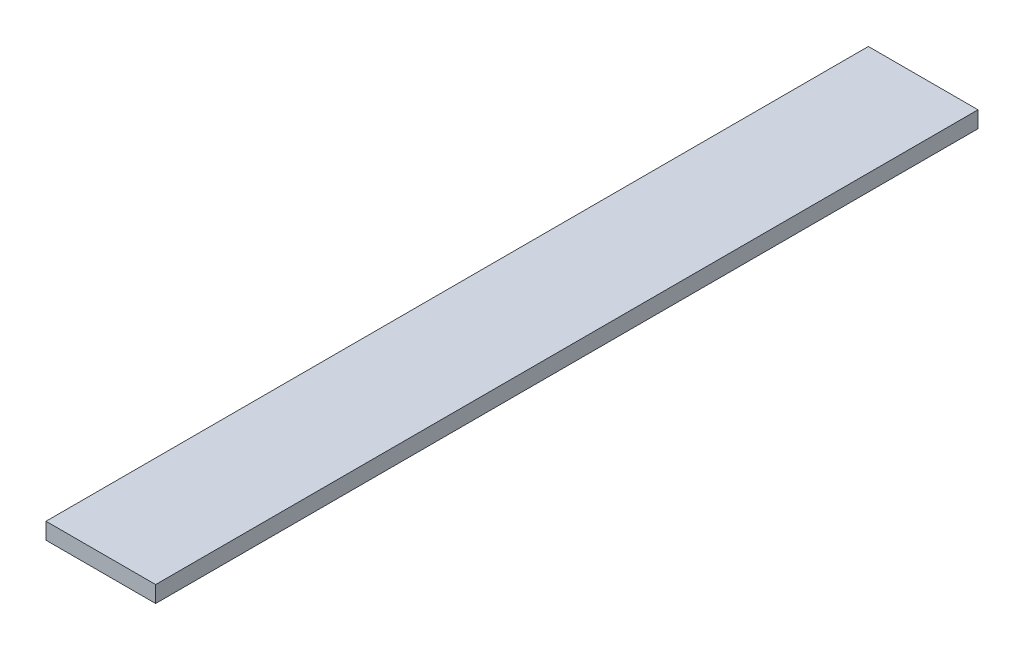
ISO-10303-21;
HEADER;
FILE_DESCRIPTION(('STEP AP214'),'2;1');
FILE_NAME('part.step','',(''),(''),'','','');
FILE_SCHEMA(('AUTOMOTIVE_DESIGN { 1 0 10303 214 1 1 1 1 }'));
ENDSEC;
DATA;
#1=APPLICATION_CONTEXT('core data for automotive mechanical design processes');
#2=APPLICATION_PROTOCOL_DEFINITION('international standard','automotive_design',2000,#1);
#3=PRODUCT_CONTEXT('',#1,'mechanical');
#4=PRODUCT('Part','Part','',(#3));
#5=PRODUCT_RELATED_PRODUCT_CATEGORY('part','',(#4));
#6=PRODUCT_DEFINITION_FORMATION('','',#4);
#7=PRODUCT_DEFINITION_CONTEXT('part definition',#1,'design');
#8=PRODUCT_DEFINITION('design','',#6,#7);
#9=PRODUCT_DEFINITION_SHAPE('','',#8);
#10=(LENGTH_UNIT() NAMED_UNIT(*) SI_UNIT(.MILLI.,.METRE.));
#11=(NAMED_UNIT(*) PLANE_ANGLE_UNIT() SI_UNIT($,.RADIAN.));
#12=(NAMED_UNIT(*) SI_UNIT($,.STERADIAN.) SOLID_ANGLE_UNIT());
#13=UNCERTAINTY_MEASURE_WITH_UNIT(LENGTH_MEASURE(1.E-05),#10,'distance_accuracy_value','');
#14=(GEOMETRIC_REPRESENTATION_CONTEXT(3) GLOBAL_UNCERTAINTY_ASSIGNED_CONTEXT((#13)) GLOBAL_UNIT_ASSIGNED_CONTEXT((#10,
#11,#12)) REPRESENTATION_CONTEXT('',''));
#15=CARTESIAN_POINT('',(0.,0.,0.));
#16=DIRECTION('',(0.,0.,1.));
#17=DIRECTION('',(1.,0.,0.));
#18=AXIS2_PLACEMENT_3D('',#15,#16,#17);
#19=CARTESIAN_POINT('',(0.259740404881448,8.61131713565076,0.));
#20=DIRECTION('',(0.,-1.,0.));
#21=DIRECTION('',(0.,0.,-1.));
#22=AXIS2_PLACEMENT_3D('',#19,#20,#21);
#23=PLANE('',#22);
#24=DIRECTION('',(1.,0.,0.));
#25=VECTOR('',#24,1.);
#26=CARTESIAN_POINT('',(-4.74025959511857,8.61131713565076,-37.5));
#27=LINE('',#26,#25);
#28=CARTESIAN_POINT('',(-9.74025959511856,8.61131713565076,-37.5));
#29=VERTEX_POINT('',#28);
#30=CARTESIAN_POINT('',(0.259740404881448,8.61131713565076,-37.5));
#31=VERTEX_POINT('',#30);
#32=EDGE_CURVE('E53',#29,#31,#27,.T.);
#33=ORIENTED_EDGE('',*,*,#32,.T.);
#34=DIRECTION('',(0.,0.,-1.));
#35=VECTOR('',#34,1.);
#36=CARTESIAN_POINT('',(0.259740404881448,8.61131713565076,0.));
#37=LINE('',#36,#35);
#38=CARTESIAN_POINT('',(0.259740404881448,8.61131713565076,37.5));
#39=VERTEX_POINT('',#38);
#40=EDGE_CURVE('E72',#39,#31,#37,.T.);
#41=ORIENTED_EDGE('',*,*,#40,.F.);
#42=DIRECTION('',(1.,0.,0.));
#43=VECTOR('',#42,1.);
#44=CARTESIAN_POINT('',(-4.74025959511857,8.61131713565076,37.5));
#45=LINE('',#44,#43);
#46=CARTESIAN_POINT('',(-9.74025959511856,8.61131713565076,37.5));
#47=VERTEX_POINT('',#46);
#48=EDGE_CURVE('E61',#47,#39,#45,.T.);
#49=ORIENTED_EDGE('',*,*,#48,.F.);
#50=DIRECTION('',(0.,0.,1.));
#51=VECTOR('',#50,1.);
#52=CARTESIAN_POINT('',(-9.74025959511856,8.61131713565076,0.));
#53=LINE('',#52,#51);
#54=EDGE_CURVE('E83',#29,#47,#53,.T.);
#55=ORIENTED_EDGE('',*,*,#54,.F.);
#56=EDGE_LOOP('',(#33,#41,#49,#55));
#57=FACE_BOUND('',#56,.T.);
#58=ADVANCED_FACE('F17',(#57),#23,.T.);
#59=CARTESIAN_POINT('',(-4.74025959511857,9.36131713565076,37.5));
#60=DIRECTION('',(0.,0.,1.));
#61=DIRECTION('',(1.,0.,0.));
#62=AXIS2_PLACEMENT_3D('',#59,#60,#61);
#63=PLANE('',#62);
#64=DIRECTION('',(0.,1.,0.));
#65=VECTOR('',#64,1.);
#66=CARTESIAN_POINT('',(0.259740404881448,10.1113171356508,37.5));
#67=LINE('',#66,#65);
#68=CARTESIAN_POINT('',(0.259740404881448,10.1113171356508,37.5));
#69=VERTEX_POINT('',#68);
#70=EDGE_CURVE('E65',#69,#39,#67,.F.);
#71=ORIENTED_EDGE('',*,*,#70,.F.);
#72=DIRECTION('',(1.,0.,0.));
#73=VECTOR('',#72,1.);
#74=CARTESIAN_POINT('',(-9.74025959511856,10.1113171356508,37.5));
#75=LINE('',#74,#73);
#76=CARTESIAN_POINT('',(-9.74025959511856,10.1113171356508,37.5));
#77=VERTEX_POINT('',#76);
#78=EDGE_CURVE('E21',#77,#69,#75,.T.);
#79=ORIENTED_EDGE('',*,*,#78,.F.);
#80=DIRECTION('',(0.,1.,0.));
#81=VECTOR('',#80,1.);
#82=CARTESIAN_POINT('',(-9.74025959511856,8.61131713565076,37.5));
#83=LINE('',#82,#81);
#84=EDGE_CURVE('E67',#47,#77,#83,.T.);
#85=ORIENTED_EDGE('',*,*,#84,.F.);
#86=ORIENTED_EDGE('',*,*,#48,.T.);
#87=EDGE_LOOP('',(#71,#79,#85,#86));
#88=FACE_BOUND('',#87,.T.);
#89=ADVANCED_FACE('F63',(#88),#63,.T.);
#90=CARTESIAN_POINT('',(0.259740404881448,10.1113171356508,0.));
#91=DIRECTION('',(1.,0.,0.));
#92=DIRECTION('',(0.,0.,-1.));
#93=AXIS2_PLACEMENT_3D('',#90,#91,#92);
#94=PLANE('',#93);
#95=DIRECTION('',(0.,1.,0.));
#96=VECTOR('',#95,1.);
#97=CARTESIAN_POINT('',(0.259740404881448,9.36131713565076,-37.5));
#98=LINE('',#97,#96);
#99=CARTESIAN_POINT('',(0.259740404881448,10.1113171356508,-37.5));
#100=VERTEX_POINT('',#99);
#101=EDGE_CURVE('E80',#31,#100,#98,.T.);
#102=ORIENTED_EDGE('',*,*,#101,.T.);
#103=DIRECTION('',(0.,0.,1.));
#104=VECTOR('',#103,1.);
#105=CARTESIAN_POINT('',(0.259740404881447,10.1113171356508,0.));
#106=LINE('',#105,#104);
#107=EDGE_CURVE('E77',#69,#100,#106,.F.);
#108=ORIENTED_EDGE('',*,*,#107,.F.);
#109=ORIENTED_EDGE('',*,*,#70,.T.);
#110=ORIENTED_EDGE('',*,*,#40,.T.);
#111=EDGE_LOOP('',(#102,#108,#109,#110));
#112=FACE_BOUND('',#111,.T.);
#113=ADVANCED_FACE('F75',(#112),#94,.T.);
#114=CARTESIAN_POINT('',(-4.74025959511857,9.36131713565076,-37.5));
#115=DIRECTION('',(0.,0.,1.));
#116=DIRECTION('',(1.,0.,0.));
#117=AXIS2_PLACEMENT_3D('',#114,#115,#116);
#118=PLANE('',#117);
#119=ORIENTED_EDGE('',*,*,#32,.F.);
#120=DIRECTION('',(0.,1.,0.));
#121=VECTOR('',#120,1.);
#122=CARTESIAN_POINT('',(-9.74025959511856,8.61131713565076,-37.5));
#123=LINE('',#122,#121);
#124=CARTESIAN_POINT('',(-9.74025959511856,10.1113171356508,-37.5));
#125=VERTEX_POINT('',#124);
#126=EDGE_CURVE('E36',#125,#29,#123,.F.);
#127=ORIENTED_EDGE('',*,*,#126,.F.);
#128=DIRECTION('',(1.,0.,0.));
#129=VECTOR('',#128,1.);
#130=CARTESIAN_POINT('',(-9.74025959511856,10.1113171356508,-37.5));
#131=LINE('',#130,#129);
#132=EDGE_CURVE('E27',#100,#125,#131,.F.);
#133=ORIENTED_EDGE('',*,*,#132,.F.);
#134=ORIENTED_EDGE('',*,*,#101,.F.);
#135=EDGE_LOOP('',(#119,#127,#133,#134));
#136=FACE_BOUND('',#135,.T.);
#137=ADVANCED_FACE('F92',(#136),#118,.F.);
#138=CARTESIAN_POINT('',(-9.74025959511856,8.61131713565076,0.));
#139=DIRECTION('',(-1.,0.,0.));
#140=DIRECTION('',(0.,0.,1.));
#141=AXIS2_PLACEMENT_3D('',#138,#139,#140);
#142=PLANE('',#141);
#143=ORIENTED_EDGE('',*,*,#126,.T.);
#144=ORIENTED_EDGE('',*,*,#54,.T.);
#145=ORIENTED_EDGE('',*,*,#84,.T.);
#146=DIRECTION('',(0.,0.,1.));
#147=VECTOR('',#146,1.);
#148=CARTESIAN_POINT('',(-9.74025959511856,10.1113171356508,0.));
#149=LINE('',#148,#147);
#150=EDGE_CURVE('E11',#125,#77,#149,.T.);
#151=ORIENTED_EDGE('',*,*,#150,.F.);
#152=EDGE_LOOP('',(#143,#144,#145,#151));
#153=FACE_BOUND('',#152,.T.);
#154=ADVANCED_FACE('F90',(#153),#142,.T.);
#155=CARTESIAN_POINT('',(-9.74025959511856,10.1113171356508,0.));
#156=DIRECTION('',(0.,1.,0.));
#157=DIRECTION('',(0.,0.,1.));
#158=AXIS2_PLACEMENT_3D('',#155,#156,#157);
#159=PLANE('',#158);
#160=ORIENTED_EDGE('',*,*,#132,.T.);
#161=ORIENTED_EDGE('',*,*,#150,.T.);
#162=ORIENTED_EDGE('',*,*,#78,.T.);
#163=ORIENTED_EDGE('',*,*,#107,.T.);
#164=EDGE_LOOP('',(#160,#161,#162,#163));
#165=FACE_BOUND('',#164,.T.);
#166=ADVANCED_FACE('F19',(#165),#159,.T.);
#167=CLOSED_SHELL('',(#58,#89,#113,#137,#154,#166));
#168=MANIFOLD_SOLID_BREP('B1',#167);
#169=ADVANCED_BREP_SHAPE_REPRESENTATION('',(#18,#168),#14);
#170=SHAPE_DEFINITION_REPRESENTATION(#9,#169);
ENDSEC;
END-ISO-10303-21;
